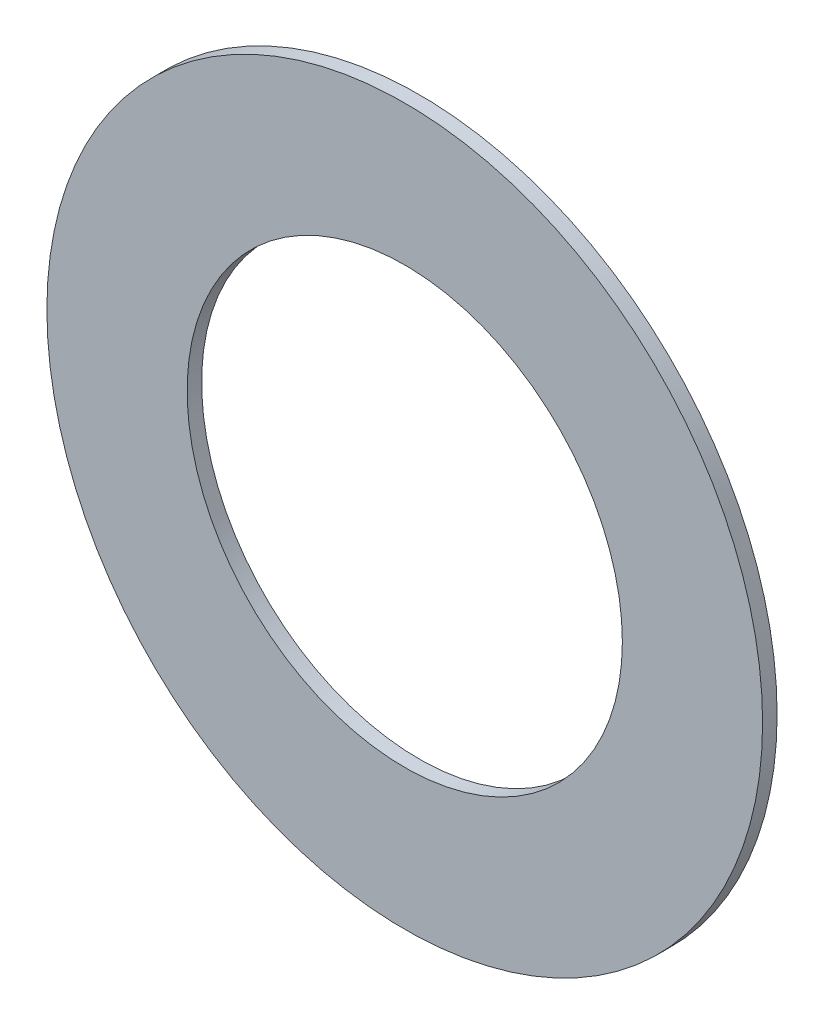
ISO-10303-21;
HEADER;
FILE_DESCRIPTION(('STEP AP214'),'2;1');
FILE_NAME('part.step','',(''),(''),'','','');
FILE_SCHEMA(('AUTOMOTIVE_DESIGN { 1 0 10303 214 1 1 1 1 }'));
ENDSEC;
DATA;
#1=APPLICATION_CONTEXT('core data for automotive mechanical design processes');
#2=APPLICATION_PROTOCOL_DEFINITION('international standard','automotive_design',2000,#1);
#3=PRODUCT_CONTEXT('',#1,'mechanical');
#4=PRODUCT('Part','Part','',(#3));
#5=PRODUCT_RELATED_PRODUCT_CATEGORY('part','',(#4));
#6=PRODUCT_DEFINITION_FORMATION('','',#4);
#7=PRODUCT_DEFINITION_CONTEXT('part definition',#1,'design');
#8=PRODUCT_DEFINITION('design','',#6,#7);
#9=PRODUCT_DEFINITION_SHAPE('','',#8);
#10=(LENGTH_UNIT() NAMED_UNIT(*) SI_UNIT(.MILLI.,.METRE.));
#11=(NAMED_UNIT(*) PLANE_ANGLE_UNIT() SI_UNIT($,.RADIAN.));
#12=(NAMED_UNIT(*) SI_UNIT($,.STERADIAN.) SOLID_ANGLE_UNIT());
#13=UNCERTAINTY_MEASURE_WITH_UNIT(LENGTH_MEASURE(1.E-05),#10,'distance_accuracy_value','');
#14=(GEOMETRIC_REPRESENTATION_CONTEXT(3) GLOBAL_UNCERTAINTY_ASSIGNED_CONTEXT((#13)) GLOBAL_UNIT_ASSIGNED_CONTEXT((#10,
#11,#12)) REPRESENTATION_CONTEXT('',''));
#15=CARTESIAN_POINT('',(0.,0.,0.));
#16=DIRECTION('',(0.,0.,1.));
#17=DIRECTION('',(1.,0.,0.));
#18=AXIS2_PLACEMENT_3D('',#15,#16,#17);
#19=CARTESIAN_POINT('',(0.,0.,1.5));
#20=DIRECTION('',(0.,0.,1.));
#21=DIRECTION('',(1.,0.,0.));
#22=AXIS2_PLACEMENT_3D('',#19,#20,#21);
#23=PLANE('',#22);
#24=CARTESIAN_POINT('',(0.,0.,1.5));
#25=DIRECTION('',(0.,0.,1.));
#26=DIRECTION('',(1.,0.,0.));
#27=AXIS2_PLACEMENT_3D('',#24,#25,#26);
#28=CIRCLE('',#27,37.);
#29=CARTESIAN_POINT('',(37.,0.,1.5));
#30=VERTEX_POINT('',#29);
#31=EDGE_CURVE('E10',#30,#30,#28,.T.);
#32=ORIENTED_EDGE('',*,*,#31,.T.);
#33=EDGE_LOOP('',(#32));
#34=FACE_BOUND('',#33,.T.);
#35=CARTESIAN_POINT('',(0.,0.,1.5));
#36=DIRECTION('',(0.,0.,1.));
#37=DIRECTION('',(1.,0.,0.));
#38=AXIS2_PLACEMENT_3D('',#35,#36,#37);
#39=CIRCLE('',#38,22.5);
#40=CARTESIAN_POINT('',(22.5,0.,1.5));
#41=VERTEX_POINT('',#40);
#42=EDGE_CURVE('E38',#41,#41,#39,.T.);
#43=ORIENTED_EDGE('',*,*,#42,.F.);
#44=EDGE_LOOP('',(#43));
#45=FACE_BOUND('',#44,.T.);
#46=ADVANCED_FACE('F27',(#34,#45),#23,.T.);
#47=CARTESIAN_POINT('',(0.,0.,0.));
#48=DIRECTION('',(0.,0.,1.));
#49=DIRECTION('',(1.,0.,0.));
#50=AXIS2_PLACEMENT_3D('',#47,#48,#49);
#51=PLANE('',#50);
#52=CARTESIAN_POINT('',(0.,0.,0.));
#53=DIRECTION('',(0.,0.,1.));
#54=DIRECTION('',(1.,0.,0.));
#55=AXIS2_PLACEMENT_3D('',#52,#53,#54);
#56=CIRCLE('',#55,37.);
#57=CARTESIAN_POINT('',(37.,0.,0.));
#58=VERTEX_POINT('',#57);
#59=EDGE_CURVE('E34',#58,#58,#56,.T.);
#60=ORIENTED_EDGE('',*,*,#59,.F.);
#61=EDGE_LOOP('',(#60));
#62=FACE_BOUND('',#61,.T.);
#63=CARTESIAN_POINT('',(0.,0.,0.));
#64=DIRECTION('',(0.,0.,1.));
#65=DIRECTION('',(1.,0.,0.));
#66=AXIS2_PLACEMENT_3D('',#63,#64,#65);
#67=CIRCLE('',#66,22.5);
#68=CARTESIAN_POINT('',(22.5,0.,0.));
#69=VERTEX_POINT('',#68);
#70=EDGE_CURVE('E42',#69,#69,#67,.T.);
#71=ORIENTED_EDGE('',*,*,#70,.T.);
#72=EDGE_LOOP('',(#71));
#73=FACE_BOUND('',#72,.T.);
#74=ADVANCED_FACE('F48',(#62,#73),#51,.F.);
#75=CARTESIAN_POINT('',(0.,0.,1.5));
#76=DIRECTION('',(0.,0.,-1.));
#77=DIRECTION('',(-1.,0.,0.));
#78=AXIS2_PLACEMENT_3D('',#75,#76,#77);
#79=CYLINDRICAL_SURFACE('',#78,37.);
#80=ORIENTED_EDGE('',*,*,#31,.F.);
#81=EDGE_LOOP('',(#80));
#82=FACE_BOUND('',#81,.T.);
#83=ORIENTED_EDGE('',*,*,#59,.T.);
#84=EDGE_LOOP('',(#83));
#85=FACE_BOUND('',#84,.T.);
#86=ADVANCED_FACE('F29',(#82,#85),#79,.T.);
#87=CARTESIAN_POINT('',(0.,0.,1.5));
#88=DIRECTION('',(0.,0.,-1.));
#89=DIRECTION('',(-1.,0.,0.));
#90=AXIS2_PLACEMENT_3D('',#87,#88,#89);
#91=CYLINDRICAL_SURFACE('',#90,22.5);
#92=ORIENTED_EDGE('',*,*,#42,.T.);
#93=EDGE_LOOP('',(#92));
#94=FACE_BOUND('',#93,.T.);
#95=ORIENTED_EDGE('',*,*,#70,.F.);
#96=EDGE_LOOP('',(#95));
#97=FACE_BOUND('',#96,.T.);
#98=ADVANCED_FACE('F50',(#94,#97),#91,.F.);
#99=CLOSED_SHELL('',(#46,#74,#86,#98));
#100=MANIFOLD_SOLID_BREP('B2',#99);
#101=ADVANCED_BREP_SHAPE_REPRESENTATION('',(#18,#100),#14);
#102=SHAPE_DEFINITION_REPRESENTATION(#9,#101);
ENDSEC;
END-ISO-10303-21;
